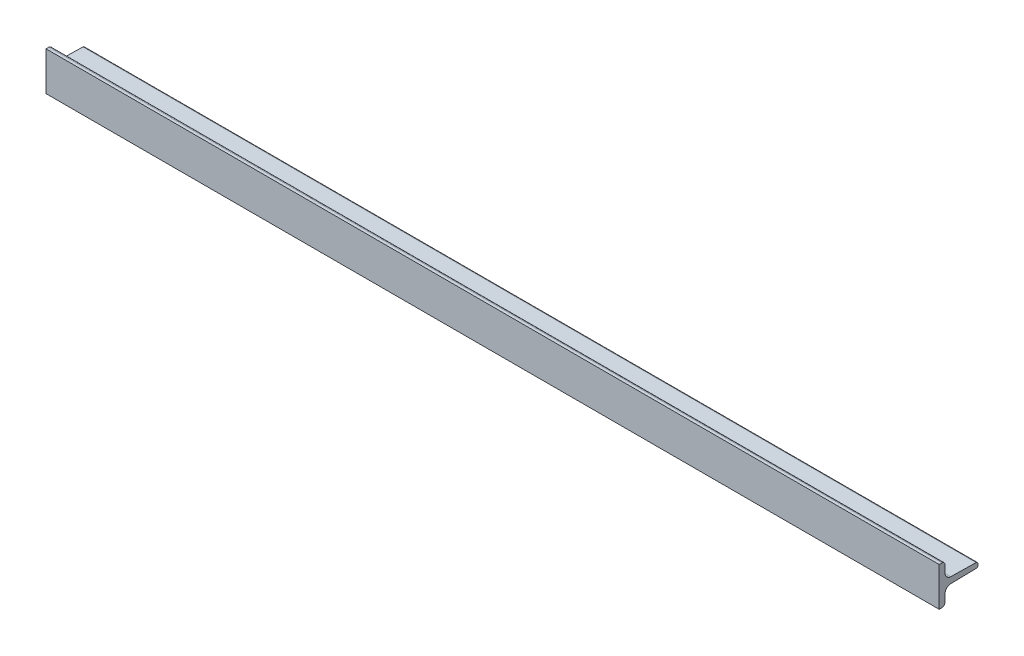
ISO-10303-21;
HEADER;
FILE_DESCRIPTION(('STEP AP214'),'2;1');
FILE_NAME('part.step','',(''),(''),'','','');
FILE_SCHEMA(('AUTOMOTIVE_DESIGN { 1 0 10303 214 1 1 1 1 }'));
ENDSEC;
DATA;
#1=APPLICATION_CONTEXT('core data for automotive mechanical design processes');
#2=APPLICATION_PROTOCOL_DEFINITION('international standard','automotive_design',2000,#1);
#3=PRODUCT_CONTEXT('',#1,'mechanical');
#4=PRODUCT('Part','Part','',(#3));
#5=PRODUCT_RELATED_PRODUCT_CATEGORY('part','',(#4));
#6=PRODUCT_DEFINITION_FORMATION('','',#4);
#7=PRODUCT_DEFINITION_CONTEXT('part definition',#1,'design');
#8=PRODUCT_DEFINITION('design','',#6,#7);
#9=PRODUCT_DEFINITION_SHAPE('','',#8);
#10=(LENGTH_UNIT() NAMED_UNIT(*) SI_UNIT(.MILLI.,.METRE.));
#11=(NAMED_UNIT(*) PLANE_ANGLE_UNIT() SI_UNIT($,.RADIAN.));
#12=(NAMED_UNIT(*) SI_UNIT($,.STERADIAN.) SOLID_ANGLE_UNIT());
#13=UNCERTAINTY_MEASURE_WITH_UNIT(LENGTH_MEASURE(1.E-05),#10,'distance_accuracy_value','');
#14=(GEOMETRIC_REPRESENTATION_CONTEXT(3) GLOBAL_UNCERTAINTY_ASSIGNED_CONTEXT((#13)) GLOBAL_UNIT_ASSIGNED_CONTEXT((#10,
#11,#12)) REPRESENTATION_CONTEXT('',''));
#15=CARTESIAN_POINT('',(0.,0.,0.));
#16=DIRECTION('',(0.,0.,1.));
#17=DIRECTION('',(1.,0.,0.));
#18=AXIS2_PLACEMENT_3D('',#15,#16,#17);
#19=CARTESIAN_POINT('',(460.,-9.99999999999999,20.));
#20=DIRECTION('',(0.,1.,0.));
#21=DIRECTION('',(0.,0.,1.));
#22=AXIS2_PLACEMENT_3D('',#19,#20,#21);
#23=PLANE('',#22);
#24=DIRECTION('',(0.,0.,-1.));
#25=VECTOR('',#24,1.);
#26=CARTESIAN_POINT('',(0.,-9.99999999999999,20.));
#27=LINE('',#26,#25);
#28=CARTESIAN_POINT('',(0.,-9.99999999999999,20.));
#29=VERTEX_POINT('',#28);
#30=CARTESIAN_POINT('',(0.,-9.99999999999999,18.570314587422));
#31=VERTEX_POINT('',#30);
#32=EDGE_CURVE('E215',#29,#31,#27,.T.);
#33=ORIENTED_EDGE('',*,*,#32,.T.);
#34=DIRECTION('',(-1.,0.,0.));
#35=VECTOR('',#34,1.);
#36=CARTESIAN_POINT('',(460.,-9.99999999999999,18.570314587422));
#37=LINE('',#36,#35);
#38=CARTESIAN_POINT('',(460.,-9.99999999999999,18.570314587422));
#39=VERTEX_POINT('',#38);
#40=EDGE_CURVE('E13',#39,#31,#37,.T.);
#41=ORIENTED_EDGE('',*,*,#40,.F.);
#42=DIRECTION('',(0.,0.,-1.));
#43=VECTOR('',#42,1.);
#44=CARTESIAN_POINT('',(460.,-9.99999999999999,20.));
#45=LINE('',#44,#43);
#46=CARTESIAN_POINT('',(460.,-9.99999999999999,20.));
#47=VERTEX_POINT('',#46);
#48=EDGE_CURVE('E241',#47,#39,#45,.T.);
#49=ORIENTED_EDGE('',*,*,#48,.F.);
#50=DIRECTION('',(-1.,0.,0.));
#51=VECTOR('',#50,1.);
#52=CARTESIAN_POINT('',(460.,-9.99999999999999,20.));
#53=LINE('',#52,#51);
#54=EDGE_CURVE('E211',#47,#29,#53,.T.);
#55=ORIENTED_EDGE('',*,*,#54,.T.);
#56=EDGE_LOOP('',(#33,#41,#49,#55));
#57=FACE_BOUND('',#56,.T.);
#58=ADVANCED_FACE('F83',(#57),#23,.F.);
#59=CARTESIAN_POINT('',(460.,-8.49999999999999,18.570314587422));
#60=DIRECTION('',(-1.,0.,0.));
#61=DIRECTION('',(0.,0.,1.));
#62=AXIS2_PLACEMENT_3D('',#59,#60,#61);
#63=CYLINDRICAL_SURFACE('',#62,1.5);
#64=CARTESIAN_POINT('',(0.,-8.49999999999999,18.570314587422));
#65=DIRECTION('',(1.,0.,0.));
#66=DIRECTION('',(0.,0.,1.));
#67=AXIS2_PLACEMENT_3D('',#64,#65,#66);
#68=CIRCLE('',#67,1.5);
#69=CARTESIAN_POINT('',(0.,-8.53000020943977,17.0706146216177));
#70=VERTEX_POINT('',#69);
#71=EDGE_CURVE('E218',#31,#70,#68,.T.);
#72=ORIENTED_EDGE('',*,*,#71,.T.);
#73=DIRECTION('',(-1.,0.,0.));
#74=VECTOR('',#73,1.);
#75=CARTESIAN_POINT('',(460.,-8.53000020943977,17.0706146216177));
#76=LINE('',#75,#74);
#77=CARTESIAN_POINT('',(460.,-8.53000020943977,17.0706146216177));
#78=VERTEX_POINT('',#77);
#79=EDGE_CURVE('E91',#78,#70,#76,.T.);
#80=ORIENTED_EDGE('',*,*,#79,.F.);
#81=CARTESIAN_POINT('',(460.,-8.49999999999999,18.570314587422));
#82=DIRECTION('',(1.,0.,0.));
#83=DIRECTION('',(0.,0.,1.));
#84=AXIS2_PLACEMENT_3D('',#81,#82,#83);
#85=CIRCLE('',#84,1.5);
#86=EDGE_CURVE('E160',#39,#78,#85,.T.);
#87=ORIENTED_EDGE('',*,*,#86,.F.);
#88=ORIENTED_EDGE('',*,*,#40,.T.);
#89=EDGE_LOOP('',(#72,#80,#87,#88));
#90=FACE_BOUND('',#89,.T.);
#91=ADVANCED_FACE('F329',(#90),#63,.T.);
#92=CARTESIAN_POINT('',(460.,-4.52043643216432,16.9904067428265));
#93=DIRECTION('',(0.,0.020000139626522,0.9997999772029));
#94=DIRECTION('',(0.,-0.9997999772029,0.020000139626522));
#95=AXIS2_PLACEMENT_3D('',#92,#93,#94);
#96=PLANE('',#95);
#97=DIRECTION('',(0.,0.9997999772029,-0.020000139626522));
#98=VECTOR('',#97,1.);
#99=CARTESIAN_POINT('',(0.,-4.52043643216432,16.9904067428265));
#100=LINE('',#99,#98);
#101=CARTESIAN_POINT('',(0.,-4.52043643216432,16.9904067428265));
#102=VERTEX_POINT('',#101);
#103=EDGE_CURVE('E220',#70,#102,#100,.T.);
#104=ORIENTED_EDGE('',*,*,#103,.T.);
#105=DIRECTION('',(-1.,0.,0.));
#106=VECTOR('',#105,1.);
#107=CARTESIAN_POINT('',(460.,-4.52043643216432,16.9904067428265));
#108=LINE('',#107,#106);
#109=CARTESIAN_POINT('',(460.,-4.52043643216432,16.9904067428265));
#110=VERTEX_POINT('',#109);
#111=EDGE_CURVE('E266',#110,#102,#108,.T.);
#112=ORIENTED_EDGE('',*,*,#111,.F.);
#113=DIRECTION('',(0.,0.9997999772029,-0.020000139626522));
#114=VECTOR('',#113,1.);
#115=CARTESIAN_POINT('',(460.,-4.52043643216432,16.9904067428265));
#116=LINE('',#115,#114);
#117=EDGE_CURVE('E274',#78,#110,#116,.T.);
#118=ORIENTED_EDGE('',*,*,#117,.F.);
#119=ORIENTED_EDGE('',*,*,#79,.T.);
#120=EDGE_LOOP('',(#104,#112,#118,#119));
#121=FACE_BOUND('',#120,.T.);
#122=ADVANCED_FACE('F272',(#121),#96,.F.);
#123=CARTESIAN_POINT('',(460.,-4.58043685104389,13.9910068112178));
#124=DIRECTION('',(-1.,0.,0.));
#125=DIRECTION('',(0.,0.,1.));
#126=AXIS2_PLACEMENT_3D('',#123,#124,#125);
#127=CYLINDRICAL_SURFACE('',#126,3.);
#128=CARTESIAN_POINT('',(0.,-4.58043685104389,13.9910068112178));
#129=DIRECTION('',(-1.,0.,0.));
#130=DIRECTION('',(0.,0.,-1.));
#131=AXIS2_PLACEMENT_3D('',#128,#129,#130);
#132=CIRCLE('',#131,3.);
#133=CARTESIAN_POINT('',(0.,-1.58103691943519,14.0510072300973));
#134=VERTEX_POINT('',#133);
#135=EDGE_CURVE('E222',#102,#134,#132,.T.);
#136=ORIENTED_EDGE('',*,*,#135,.T.);
#137=DIRECTION('',(-1.,0.,0.));
#138=VECTOR('',#137,1.);
#139=CARTESIAN_POINT('',(460.,-1.58103691943519,14.0510072300973));
#140=LINE('',#139,#138);
#141=CARTESIAN_POINT('',(460.,-1.58103691943519,14.0510072300973));
#142=VERTEX_POINT('',#141);
#143=EDGE_CURVE('E263',#142,#134,#140,.T.);
#144=ORIENTED_EDGE('',*,*,#143,.F.);
#145=CARTESIAN_POINT('',(460.,-4.58043685104389,13.9910068112178));
#146=DIRECTION('',(-1.,0.,0.));
#147=DIRECTION('',(0.,0.,-1.));
#148=AXIS2_PLACEMENT_3D('',#145,#146,#147);
#149=CIRCLE('',#148,3.);
#150=EDGE_CURVE('E292',#110,#142,#149,.T.);
#151=ORIENTED_EDGE('',*,*,#150,.F.);
#152=ORIENTED_EDGE('',*,*,#111,.T.);
#153=EDGE_LOOP('',(#136,#144,#151,#152));
#154=FACE_BOUND('',#153,.T.);
#155=ADVANCED_FACE('F283',(#154),#127,.F.);
#156=CARTESIAN_POINT('',(460.,-1.3195626461658,0.97999986037347));
#157=DIRECTION('',(0.,0.9997999772029,0.0200001396265305));
#158=DIRECTION('',(0.,-0.0200001396265305,0.9997999772029));
#159=AXIS2_PLACEMENT_3D('',#156,#157,#158);
#160=PLANE('',#159);
#161=DIRECTION('',(0.,0.0200001396265305,-0.9997999772029));
#162=VECTOR('',#161,1.);
#163=CARTESIAN_POINT('',(0.,-1.3195626461658,0.97999986037347));
#164=LINE('',#163,#162);
#165=CARTESIAN_POINT('',(0.,-1.3195626461658,0.979999860373471));
#166=VERTEX_POINT('',#165);
#167=EDGE_CURVE('E224',#134,#166,#164,.T.);
#168=ORIENTED_EDGE('',*,*,#167,.T.);
#169=DIRECTION('',(-1.,0.,0.));
#170=VECTOR('',#169,1.);
#171=CARTESIAN_POINT('',(460.,-1.3195626461658,0.979999860373471));
#172=LINE('',#171,#170);
#173=CARTESIAN_POINT('',(460.,-1.3195626461658,0.979999860373471));
#174=VERTEX_POINT('',#173);
#175=EDGE_CURVE('E260',#174,#166,#172,.T.);
#176=ORIENTED_EDGE('',*,*,#175,.F.);
#177=DIRECTION('',(0.,0.0200001396265305,-0.9997999772029));
#178=VECTOR('',#177,1.);
#179=CARTESIAN_POINT('',(460.,-1.3195626461658,0.97999986037347));
#180=LINE('',#179,#178);
#181=EDGE_CURVE('E289',#142,#174,#180,.T.);
#182=ORIENTED_EDGE('',*,*,#181,.F.);
#183=ORIENTED_EDGE('',*,*,#143,.T.);
#184=EDGE_LOOP('',(#168,#176,#182,#183));
#185=FACE_BOUND('',#184,.T.);
#186=ADVANCED_FACE('F287',(#185),#160,.F.);
#187=CARTESIAN_POINT('',(460.,-0.319762668962899,1.));
#188=DIRECTION('',(-1.,0.,0.));
#189=DIRECTION('',(0.,0.,1.));
#190=AXIS2_PLACEMENT_3D('',#187,#188,#189);
#191=CYLINDRICAL_SURFACE('',#190,1.);
#192=CARTESIAN_POINT('',(0.,-0.319762668962899,1.));
#193=DIRECTION('',(1.,0.,0.));
#194=DIRECTION('',(0.,0.,1.));
#195=AXIS2_PLACEMENT_3D('',#192,#193,#194);
#196=CIRCLE('',#195,1.);
#197=CARTESIAN_POINT('',(0.,-0.319762668962899,0.));
#198=VERTEX_POINT('',#197);
#199=EDGE_CURVE('E226',#166,#198,#196,.T.);
#200=ORIENTED_EDGE('',*,*,#199,.T.);
#201=DIRECTION('',(-1.,0.,0.));
#202=VECTOR('',#201,1.);
#203=CARTESIAN_POINT('',(460.,-0.319762668962899,0.));
#204=LINE('',#203,#202);
#205=CARTESIAN_POINT('',(460.,-0.319762668962899,0.));
#206=VERTEX_POINT('',#205);
#207=EDGE_CURVE('E257',#206,#198,#204,.T.);
#208=ORIENTED_EDGE('',*,*,#207,.F.);
#209=CARTESIAN_POINT('',(460.,-0.319762668962899,1.));
#210=DIRECTION('',(1.,0.,0.));
#211=DIRECTION('',(0.,0.,1.));
#212=AXIS2_PLACEMENT_3D('',#209,#210,#211);
#213=CIRCLE('',#212,1.);
#214=EDGE_CURVE('E291',#174,#206,#213,.T.);
#215=ORIENTED_EDGE('',*,*,#214,.F.);
#216=ORIENTED_EDGE('',*,*,#175,.T.);
#217=EDGE_LOOP('',(#200,#208,#215,#216));
#218=FACE_BOUND('',#217,.T.);
#219=ADVANCED_FACE('F342',(#218),#191,.T.);
#220=CARTESIAN_POINT('',(460.,-0.319762668962899,0.));
#221=DIRECTION('',(0.,0.,1.));
#222=DIRECTION('',(0.,-1.,0.));
#223=AXIS2_PLACEMENT_3D('',#220,#221,#222);
#224=PLANE('',#223);
#225=DIRECTION('',(0.,1.,0.));
#226=VECTOR('',#225,1.);
#227=CARTESIAN_POINT('',(0.,-0.319762668962899,0.));
#228=LINE('',#227,#226);
#229=CARTESIAN_POINT('',(0.,0.319762668962919,0.));
#230=VERTEX_POINT('',#229);
#231=EDGE_CURVE('E228',#198,#230,#228,.T.);
#232=ORIENTED_EDGE('',*,*,#231,.T.);
#233=DIRECTION('',(-1.,0.,0.));
#234=VECTOR('',#233,1.);
#235=CARTESIAN_POINT('',(460.,0.319762668962919,0.));
#236=LINE('',#235,#234);
#237=CARTESIAN_POINT('',(460.,0.319762668962919,0.));
#238=VERTEX_POINT('',#237);
#239=EDGE_CURVE('E254',#238,#230,#236,.T.);
#240=ORIENTED_EDGE('',*,*,#239,.F.);
#241=DIRECTION('',(0.,1.,0.));
#242=VECTOR('',#241,1.);
#243=CARTESIAN_POINT('',(460.,-0.319762668962899,0.));
#244=LINE('',#243,#242);
#245=EDGE_CURVE('E294',#206,#238,#244,.T.);
#246=ORIENTED_EDGE('',*,*,#245,.F.);
#247=ORIENTED_EDGE('',*,*,#207,.T.);
#248=EDGE_LOOP('',(#232,#240,#246,#247));
#249=FACE_BOUND('',#248,.T.);
#250=ADVANCED_FACE('F345',(#249),#224,.F.);
#251=CARTESIAN_POINT('',(460.,0.319762668962918,1.));
#252=DIRECTION('',(-1.,0.,0.));
#253=DIRECTION('',(0.,0.,1.));
#254=AXIS2_PLACEMENT_3D('',#251,#252,#253);
#255=CYLINDRICAL_SURFACE('',#254,1.);
#256=CARTESIAN_POINT('',(0.,0.319762668962918,1.));
#257=DIRECTION('',(1.,0.,0.));
#258=DIRECTION('',(0.,0.,1.));
#259=AXIS2_PLACEMENT_3D('',#256,#257,#258);
#260=CIRCLE('',#259,1.);
#261=CARTESIAN_POINT('',(0.,1.31956264616582,0.97999986037347));
#262=VERTEX_POINT('',#261);
#263=EDGE_CURVE('E230',#230,#262,#260,.T.);
#264=ORIENTED_EDGE('',*,*,#263,.T.);
#265=DIRECTION('',(-1.,0.,0.));
#266=VECTOR('',#265,1.);
#267=CARTESIAN_POINT('',(460.,1.31956264616582,0.97999986037347));
#268=LINE('',#267,#266);
#269=CARTESIAN_POINT('',(460.,1.31956264616582,0.97999986037347));
#270=VERTEX_POINT('',#269);
#271=EDGE_CURVE('E251',#270,#262,#268,.T.);
#272=ORIENTED_EDGE('',*,*,#271,.F.);
#273=CARTESIAN_POINT('',(460.,0.319762668962918,1.));
#274=DIRECTION('',(1.,0.,0.));
#275=DIRECTION('',(0.,0.,1.));
#276=AXIS2_PLACEMENT_3D('',#273,#274,#275);
#277=CIRCLE('',#276,1.);
#278=EDGE_CURVE('E300',#238,#270,#277,.T.);
#279=ORIENTED_EDGE('',*,*,#278,.F.);
#280=ORIENTED_EDGE('',*,*,#239,.T.);
#281=EDGE_LOOP('',(#264,#272,#279,#280));
#282=FACE_BOUND('',#281,.T.);
#283=ADVANCED_FACE('F349',(#282),#255,.T.);
#284=CARTESIAN_POINT('',(460.,1.58103691943522,14.0510072300973));
#285=DIRECTION('',(0.,-0.9997999772029,0.0200001396265308));
#286=DIRECTION('',(0.,-0.0200001396265308,-0.9997999772029));
#287=AXIS2_PLACEMENT_3D('',#284,#285,#286);
#288=PLANE('',#287);
#289=DIRECTION('',(0.,0.0200001396265308,0.9997999772029));
#290=VECTOR('',#289,1.);
#291=CARTESIAN_POINT('',(0.,1.58103691943522,14.0510072300973));
#292=LINE('',#291,#290);
#293=CARTESIAN_POINT('',(0.,1.58103691943521,14.0510072300973));
#294=VERTEX_POINT('',#293);
#295=EDGE_CURVE('E232',#262,#294,#292,.T.);
#296=ORIENTED_EDGE('',*,*,#295,.T.);
#297=DIRECTION('',(-1.,0.,0.));
#298=VECTOR('',#297,1.);
#299=CARTESIAN_POINT('',(460.,1.58103691943521,14.0510072300973));
#300=LINE('',#299,#298);
#301=CARTESIAN_POINT('',(460.,1.58103691943521,14.0510072300973));
#302=VERTEX_POINT('',#301);
#303=EDGE_CURVE('E248',#302,#294,#300,.T.);
#304=ORIENTED_EDGE('',*,*,#303,.F.);
#305=DIRECTION('',(0.,0.0200001396265308,0.9997999772029));
#306=VECTOR('',#305,1.);
#307=CARTESIAN_POINT('',(460.,1.58103691943522,14.0510072300973));
#308=LINE('',#307,#306);
#309=EDGE_CURVE('E302',#270,#302,#308,.T.);
#310=ORIENTED_EDGE('',*,*,#309,.F.);
#311=ORIENTED_EDGE('',*,*,#271,.T.);
#312=EDGE_LOOP('',(#296,#304,#310,#311));
#313=FACE_BOUND('',#312,.T.);
#314=ADVANCED_FACE('F353',(#313),#288,.F.);
#315=CARTESIAN_POINT('',(460.,4.58043685104392,13.9910068112178));
#316=DIRECTION('',(-1.,0.,0.));
#317=DIRECTION('',(0.,0.,1.));
#318=AXIS2_PLACEMENT_3D('',#315,#316,#317);
#319=CYLINDRICAL_SURFACE('',#318,3.);
#320=CARTESIAN_POINT('',(0.,4.58043685104392,13.9910068112178));
#321=DIRECTION('',(-1.,0.,0.));
#322=DIRECTION('',(0.,0.,-1.));
#323=AXIS2_PLACEMENT_3D('',#320,#321,#322);
#324=CIRCLE('',#323,3.);
#325=CARTESIAN_POINT('',(0.,4.52043643216434,16.9904067428265));
#326=VERTEX_POINT('',#325);
#327=EDGE_CURVE('E234',#294,#326,#324,.T.);
#328=ORIENTED_EDGE('',*,*,#327,.T.);
#329=DIRECTION('',(-1.,0.,0.));
#330=VECTOR('',#329,1.);
#331=CARTESIAN_POINT('',(460.,4.52043643216434,16.9904067428265));
#332=LINE('',#331,#330);
#333=CARTESIAN_POINT('',(460.,4.52043643216434,16.9904067428265));
#334=VERTEX_POINT('',#333);
#335=EDGE_CURVE('E245',#334,#326,#332,.T.);
#336=ORIENTED_EDGE('',*,*,#335,.F.);
#337=CARTESIAN_POINT('',(460.,4.58043685104392,13.9910068112178));
#338=DIRECTION('',(-1.,0.,0.));
#339=DIRECTION('',(0.,0.,-1.));
#340=AXIS2_PLACEMENT_3D('',#337,#338,#339);
#341=CIRCLE('',#340,3.);
#342=EDGE_CURVE('E304',#302,#334,#341,.T.);
#343=ORIENTED_EDGE('',*,*,#342,.F.);
#344=ORIENTED_EDGE('',*,*,#303,.T.);
#345=EDGE_LOOP('',(#328,#336,#343,#344));
#346=FACE_BOUND('',#345,.T.);
#347=ADVANCED_FACE('F310',(#346),#319,.F.);
#348=CARTESIAN_POINT('',(460.,8.53000020943979,17.0706146216177));
#349=DIRECTION('',(0.,-0.020000139626522,0.9997999772029));
#350=DIRECTION('',(0.,-0.9997999772029,-0.020000139626522));
#351=AXIS2_PLACEMENT_3D('',#348,#349,#350);
#352=PLANE('',#351);
#353=DIRECTION('',(0.,0.9997999772029,0.020000139626522));
#354=VECTOR('',#353,1.);
#355=CARTESIAN_POINT('',(0.,8.53000020943979,17.0706146216177));
#356=LINE('',#355,#354);
#357=CARTESIAN_POINT('',(0.,8.53000020943979,17.0706146216177));
#358=VERTEX_POINT('',#357);
#359=EDGE_CURVE('E236',#326,#358,#356,.T.);
#360=ORIENTED_EDGE('',*,*,#359,.T.);
#361=DIRECTION('',(-1.,0.,0.));
#362=VECTOR('',#361,1.);
#363=CARTESIAN_POINT('',(460.,8.53000020943979,17.0706146216177));
#364=LINE('',#363,#362);
#365=CARTESIAN_POINT('',(460.,8.53000020943979,17.0706146216177));
#366=VERTEX_POINT('',#365);
#367=EDGE_CURVE('E206',#366,#358,#364,.T.);
#368=ORIENTED_EDGE('',*,*,#367,.F.);
#369=DIRECTION('',(0.,0.9997999772029,0.020000139626522));
#370=VECTOR('',#369,1.);
#371=CARTESIAN_POINT('',(460.,8.53000020943979,17.0706146216177));
#372=LINE('',#371,#370);
#373=EDGE_CURVE('E197',#334,#366,#372,.T.);
#374=ORIENTED_EDGE('',*,*,#373,.F.);
#375=ORIENTED_EDGE('',*,*,#335,.T.);
#376=EDGE_LOOP('',(#360,#368,#374,#375));
#377=FACE_BOUND('',#376,.T.);
#378=ADVANCED_FACE('F314',(#377),#352,.F.);
#379=CARTESIAN_POINT('',(460.,8.50000000000001,18.570314587422));
#380=DIRECTION('',(-1.,0.,0.));
#381=DIRECTION('',(0.,0.,1.));
#382=AXIS2_PLACEMENT_3D('',#379,#380,#381);
#383=CYLINDRICAL_SURFACE('',#382,1.5);
#384=CARTESIAN_POINT('',(0.,8.50000000000001,18.570314587422));
#385=DIRECTION('',(1.,0.,0.));
#386=DIRECTION('',(0.,0.,-1.));
#387=AXIS2_PLACEMENT_3D('',#384,#385,#386);
#388=CIRCLE('',#387,1.5);
#389=CARTESIAN_POINT('',(0.,10.,18.570314587422));
#390=VERTEX_POINT('',#389);
#391=EDGE_CURVE('E205',#358,#390,#388,.T.);
#392=ORIENTED_EDGE('',*,*,#391,.T.);
#393=DIRECTION('',(-1.,0.,0.));
#394=VECTOR('',#393,1.);
#395=CARTESIAN_POINT('',(460.,10.,18.570314587422));
#396=LINE('',#395,#394);
#397=CARTESIAN_POINT('',(460.,10.,18.570314587422));
#398=VERTEX_POINT('',#397);
#399=EDGE_CURVE('E202',#398,#390,#396,.T.);
#400=ORIENTED_EDGE('',*,*,#399,.F.);
#401=CARTESIAN_POINT('',(460.,8.50000000000001,18.570314587422));
#402=DIRECTION('',(1.,0.,0.));
#403=DIRECTION('',(0.,0.,-1.));
#404=AXIS2_PLACEMENT_3D('',#401,#402,#403);
#405=CIRCLE('',#404,1.5);
#406=EDGE_CURVE('E191',#366,#398,#405,.T.);
#407=ORIENTED_EDGE('',*,*,#406,.F.);
#408=ORIENTED_EDGE('',*,*,#367,.T.);
#409=EDGE_LOOP('',(#392,#400,#407,#408));
#410=FACE_BOUND('',#409,.T.);
#411=ADVANCED_FACE('F203',(#410),#383,.T.);
#412=CARTESIAN_POINT('',(460.,10.,20.));
#413=DIRECTION('',(0.,-1.,0.));
#414=DIRECTION('',(0.,0.,-1.));
#415=AXIS2_PLACEMENT_3D('',#412,#413,#414);
#416=PLANE('',#415);
#417=DIRECTION('',(0.,0.,1.));
#418=VECTOR('',#417,1.);
#419=CARTESIAN_POINT('',(0.,10.,20.));
#420=LINE('',#419,#418);
#421=CARTESIAN_POINT('',(0.,10.,20.));
#422=VERTEX_POINT('',#421);
#423=EDGE_CURVE('E146',#390,#422,#420,.T.);
#424=ORIENTED_EDGE('',*,*,#423,.T.);
#425=DIRECTION('',(-1.,0.,0.));
#426=VECTOR('',#425,1.);
#427=CARTESIAN_POINT('',(460.,10.,20.));
#428=LINE('',#427,#426);
#429=CARTESIAN_POINT('',(460.,10.,20.));
#430=VERTEX_POINT('',#429);
#431=EDGE_CURVE('E207',#430,#422,#428,.T.);
#432=ORIENTED_EDGE('',*,*,#431,.F.);
#433=DIRECTION('',(0.,0.,1.));
#434=VECTOR('',#433,1.);
#435=CARTESIAN_POINT('',(460.,10.,20.));
#436=LINE('',#435,#434);
#437=EDGE_CURVE('E195',#398,#430,#436,.T.);
#438=ORIENTED_EDGE('',*,*,#437,.F.);
#439=ORIENTED_EDGE('',*,*,#399,.T.);
#440=EDGE_LOOP('',(#424,#432,#438,#439));
#441=FACE_BOUND('',#440,.T.);
#442=ADVANCED_FACE('F209',(#441),#416,.F.);
#443=CARTESIAN_POINT('',(460.,-9.99999999999999,20.));
#444=DIRECTION('',(0.,0.,-1.));
#445=DIRECTION('',(-1.,0.,0.));
#446=AXIS2_PLACEMENT_3D('',#443,#444,#445);
#447=PLANE('',#446);
#448=DIRECTION('',(0.,-1.,0.));
#449=VECTOR('',#448,1.);
#450=CARTESIAN_POINT('',(0.,-9.99999999999999,20.));
#451=LINE('',#450,#449);
#452=EDGE_CURVE('E152',#422,#29,#451,.T.);
#453=ORIENTED_EDGE('',*,*,#452,.T.);
#454=ORIENTED_EDGE('',*,*,#54,.F.);
#455=DIRECTION('',(0.,-1.,0.));
#456=VECTOR('',#455,1.);
#457=CARTESIAN_POINT('',(460.,-9.99999999999999,20.));
#458=LINE('',#457,#456);
#459=EDGE_CURVE('E99',#430,#47,#458,.T.);
#460=ORIENTED_EDGE('',*,*,#459,.F.);
#461=ORIENTED_EDGE('',*,*,#431,.T.);
#462=EDGE_LOOP('',(#453,#454,#460,#461));
#463=FACE_BOUND('',#462,.T.);
#464=ADVANCED_FACE('F318',(#463),#447,.F.);
#465=CARTESIAN_POINT('',(460.,-8.49999999999999,18.570314587422));
#466=DIRECTION('',(-1.,0.,0.));
#467=DIRECTION('',(0.,0.,1.));
#468=AXIS2_PLACEMENT_3D('',#465,#466,#467);
#469=PLANE('',#468);
#470=ORIENTED_EDGE('',*,*,#48,.T.);
#471=ORIENTED_EDGE('',*,*,#86,.T.);
#472=ORIENTED_EDGE('',*,*,#117,.T.);
#473=ORIENTED_EDGE('',*,*,#150,.T.);
#474=ORIENTED_EDGE('',*,*,#181,.T.);
#475=ORIENTED_EDGE('',*,*,#214,.T.);
#476=ORIENTED_EDGE('',*,*,#245,.T.);
#477=ORIENTED_EDGE('',*,*,#278,.T.);
#478=ORIENTED_EDGE('',*,*,#309,.T.);
#479=ORIENTED_EDGE('',*,*,#342,.T.);
#480=ORIENTED_EDGE('',*,*,#373,.T.);
#481=ORIENTED_EDGE('',*,*,#406,.T.);
#482=ORIENTED_EDGE('',*,*,#437,.T.);
#483=ORIENTED_EDGE('',*,*,#459,.T.);
#484=EDGE_LOOP('',(#470,#471,#472,#473,#474,#475,#476,#477,#478,#479,#480,#481,#482,#483));
#485=FACE_BOUND('',#484,.T.);
#486=ADVANCED_FACE('F193',(#485),#469,.F.);
#487=CARTESIAN_POINT('',(0.,-8.49999999999999,18.570314587422));
#488=DIRECTION('',(-1.,0.,0.));
#489=DIRECTION('',(0.,0.,1.));
#490=AXIS2_PLACEMENT_3D('',#487,#488,#489);
#491=PLANE('',#490);
#492=ORIENTED_EDGE('',*,*,#32,.F.);
#493=ORIENTED_EDGE('',*,*,#452,.F.);
#494=ORIENTED_EDGE('',*,*,#423,.F.);
#495=ORIENTED_EDGE('',*,*,#391,.F.);
#496=ORIENTED_EDGE('',*,*,#359,.F.);
#497=ORIENTED_EDGE('',*,*,#327,.F.);
#498=ORIENTED_EDGE('',*,*,#295,.F.);
#499=ORIENTED_EDGE('',*,*,#263,.F.);
#500=ORIENTED_EDGE('',*,*,#231,.F.);
#501=ORIENTED_EDGE('',*,*,#199,.F.);
#502=ORIENTED_EDGE('',*,*,#167,.F.);
#503=ORIENTED_EDGE('',*,*,#135,.F.);
#504=ORIENTED_EDGE('',*,*,#103,.F.);
#505=ORIENTED_EDGE('',*,*,#71,.F.);
#506=EDGE_LOOP('',(#492,#493,#494,#495,#496,#497,#498,#499,#500,#501,#502,#503,#504,#505));
#507=FACE_BOUND('',#506,.T.);
#508=ADVANCED_FACE('F278',(#507),#491,.T.);
#509=CLOSED_SHELL('',(#58,#91,#122,#155,#186,#219,#250,#283,#314,#347,#378,#411,#442,#464,#486,#508));
#510=MANIFOLD_SOLID_BREP('B2',#509);
#511=ADVANCED_BREP_SHAPE_REPRESENTATION('',(#18,#510),#14);
#512=SHAPE_DEFINITION_REPRESENTATION(#9,#511);
ENDSEC;
END-ISO-10303-21;
